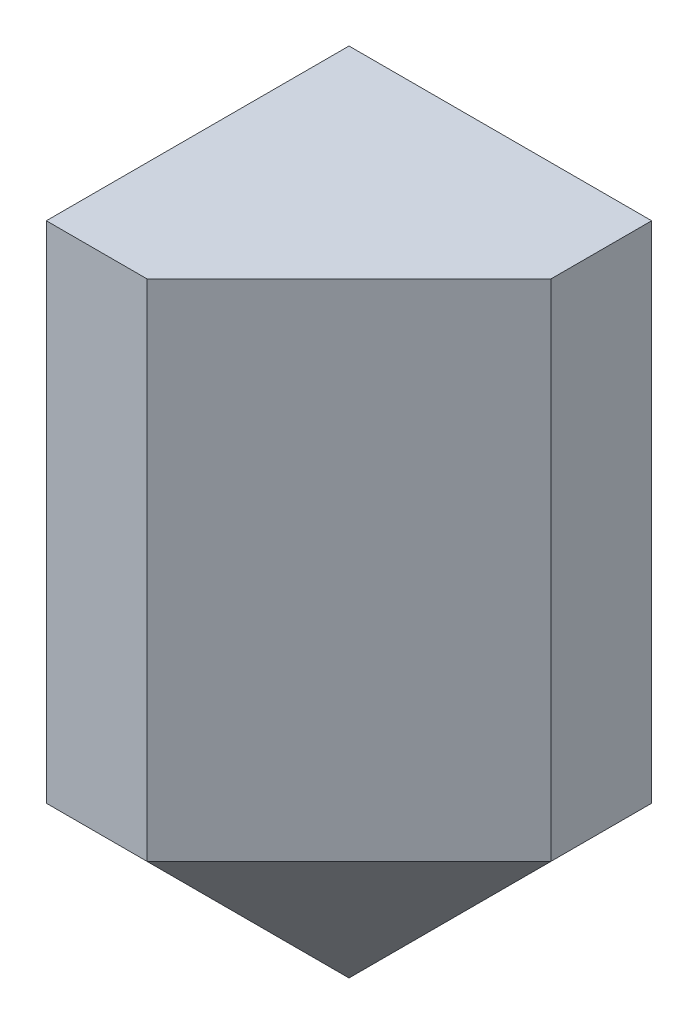
ISO-10303-21;
HEADER;
FILE_DESCRIPTION(('STEP AP214'),'2;1');
FILE_NAME('part.step','',(''),(''),'','','');
FILE_SCHEMA(('AUTOMOTIVE_DESIGN { 1 0 10303 214 1 1 1 1 }'));
ENDSEC;
DATA;
#1=APPLICATION_CONTEXT('core data for automotive mechanical design processes');
#2=APPLICATION_PROTOCOL_DEFINITION('international standard','automotive_design',2000,#1);
#3=PRODUCT_CONTEXT('',#1,'mechanical');
#4=PRODUCT('Part','Part','',(#3));
#5=PRODUCT_RELATED_PRODUCT_CATEGORY('part','',(#4));
#6=PRODUCT_DEFINITION_FORMATION('','',#4);
#7=PRODUCT_DEFINITION_CONTEXT('part definition',#1,'design');
#8=PRODUCT_DEFINITION('design','',#6,#7);
#9=PRODUCT_DEFINITION_SHAPE('','',#8);
#10=(LENGTH_UNIT() NAMED_UNIT(*) SI_UNIT(.MILLI.,.METRE.));
#11=(NAMED_UNIT(*) PLANE_ANGLE_UNIT() SI_UNIT($,.RADIAN.));
#12=(NAMED_UNIT(*) SI_UNIT($,.STERADIAN.) SOLID_ANGLE_UNIT());
#13=UNCERTAINTY_MEASURE_WITH_UNIT(LENGTH_MEASURE(1.E-05),#10,'distance_accuracy_value','');
#14=(GEOMETRIC_REPRESENTATION_CONTEXT(3) GLOBAL_UNCERTAINTY_ASSIGNED_CONTEXT((#13)) GLOBAL_UNIT_ASSIGNED_CONTEXT((#10,
#11,#12)) REPRESENTATION_CONTEXT('',''));
#15=CARTESIAN_POINT('',(0.,0.,0.));
#16=DIRECTION('',(0.,0.,1.));
#17=DIRECTION('',(1.,0.,0.));
#18=AXIS2_PLACEMENT_3D('',#15,#16,#17);
#19=CARTESIAN_POINT('',(0.,0.,30.));
#20=DIRECTION('',(1.,0.,0.));
#21=DIRECTION('',(0.,0.,-1.));
#22=AXIS2_PLACEMENT_3D('',#19,#20,#21);
#23=PLANE('',#22);
#24=CARTESIAN_POINT('',(0.,55.,15.));
#25=DIRECTION('',(-1.,0.,0.));
#26=DIRECTION('',(0.,0.,1.));
#27=AXIS2_PLACEMENT_3D('',#24,#25,#26);
#28=CIRCLE('',#27,7.5);
#29=CARTESIAN_POINT('',(0.,55.,22.5));
#30=VERTEX_POINT('',#29);
#31=EDGE_CURVE('E115',#30,#30,#28,.T.);
#32=ORIENTED_EDGE('',*,*,#31,.F.);
#33=EDGE_LOOP('',(#32));
#34=FACE_BOUND('',#33,.T.);
#35=CARTESIAN_POINT('',(0.,20.,18.));
#36=DIRECTION('',(-1.,0.,0.));
#37=DIRECTION('',(0.,0.,1.));
#38=AXIS2_PLACEMENT_3D('',#35,#36,#37);
#39=CIRCLE('',#38,2.75);
#40=CARTESIAN_POINT('',(0.,20.,20.75));
#41=VERTEX_POINT('',#40);
#42=EDGE_CURVE('E138',#41,#41,#39,.T.);
#43=ORIENTED_EDGE('',*,*,#42,.F.);
#44=EDGE_LOOP('',(#43));
#45=FACE_BOUND('',#44,.T.);
#46=DIRECTION('',(0.,0.,-1.));
#47=VECTOR('',#46,1.);
#48=CARTESIAN_POINT('',(0.,0.,30.));
#49=LINE('',#48,#47);
#50=CARTESIAN_POINT('',(0.,0.,9.99999999999995));
#51=VERTEX_POINT('',#50);
#52=CARTESIAN_POINT('',(0.,0.,0.));
#53=VERTEX_POINT('',#52);
#54=EDGE_CURVE('E163',#51,#53,#49,.T.);
#55=ORIENTED_EDGE('',*,*,#54,.F.);
#56=DIRECTION('',(0.,-0.707106781186546,-0.707106781186549));
#57=VECTOR('',#56,1.);
#58=CARTESIAN_POINT('',(0.,20.,30.));
#59=LINE('',#58,#57);
#60=CARTESIAN_POINT('',(0.,20.,30.));
#61=VERTEX_POINT('',#60);
#62=EDGE_CURVE('E11',#51,#61,#59,.F.);
#63=ORIENTED_EDGE('',*,*,#62,.T.);
#64=DIRECTION('',(0.,-1.,0.));
#65=VECTOR('',#64,1.);
#66=CARTESIAN_POINT('',(0.,0.,30.));
#67=LINE('',#66,#65);
#68=CARTESIAN_POINT('',(0.,70.,30.));
#69=VERTEX_POINT('',#68);
#70=EDGE_CURVE('E160',#69,#61,#67,.T.);
#71=ORIENTED_EDGE('',*,*,#70,.F.);
#72=DIRECTION('',(0.,0.,1.));
#73=VECTOR('',#72,1.);
#74=CARTESIAN_POINT('',(0.,70.,30.));
#75=LINE('',#74,#73);
#76=CARTESIAN_POINT('',(0.,70.,0.));
#77=VERTEX_POINT('',#76);
#78=EDGE_CURVE('E144',#77,#69,#75,.T.);
#79=ORIENTED_EDGE('',*,*,#78,.F.);
#80=DIRECTION('',(0.,-1.,0.));
#81=VECTOR('',#80,1.);
#82=CARTESIAN_POINT('',(0.,0.,0.));
#83=LINE('',#82,#81);
#84=EDGE_CURVE('E165',#77,#53,#83,.T.);
#85=ORIENTED_EDGE('',*,*,#84,.T.);
#86=EDGE_LOOP('',(#55,#63,#71,#79,#85));
#87=FACE_BOUND('',#86,.T.);
#88=ADVANCED_FACE('F39',(#34,#45,#87),#23,.F.);
#89=CARTESIAN_POINT('',(0.,0.,30.));
#90=DIRECTION('',(0.,1.,0.));
#91=DIRECTION('',(0.,0.,1.));
#92=AXIS2_PLACEMENT_3D('',#89,#90,#91);
#93=PLANE('',#92);
#94=DIRECTION('',(1.,0.,0.));
#95=VECTOR('',#94,1.);
#96=CARTESIAN_POINT('',(0.,0.,0.));
#97=LINE('',#96,#95);
#98=CARTESIAN_POINT('',(9.99999999999995,0.,0.));
#99=VERTEX_POINT('',#98);
#100=EDGE_CURVE('E168',#53,#99,#97,.T.);
#101=ORIENTED_EDGE('',*,*,#100,.T.);
#102=DIRECTION('',(0.,0.,1.));
#103=VECTOR('',#102,1.);
#104=CARTESIAN_POINT('',(9.99999999999995,0.,30.));
#105=LINE('',#104,#103);
#106=CARTESIAN_POINT('',(9.99999999999995,0.,9.99999999999995));
#107=VERTEX_POINT('',#106);
#108=EDGE_CURVE('E49',#99,#107,#105,.T.);
#109=ORIENTED_EDGE('',*,*,#108,.T.);
#110=DIRECTION('',(-1.,0.,0.));
#111=VECTOR('',#110,1.);
#112=CARTESIAN_POINT('',(0.,0.,9.99999999999995));
#113=LINE('',#112,#111);
#114=EDGE_CURVE('E60',#107,#51,#113,.T.);
#115=ORIENTED_EDGE('',*,*,#114,.T.);
#116=ORIENTED_EDGE('',*,*,#54,.T.);
#117=EDGE_LOOP('',(#101,#109,#115,#116));
#118=FACE_BOUND('',#117,.T.);
#119=ADVANCED_FACE('F221',(#118),#93,.F.);
#120=CARTESIAN_POINT('',(30.,0.,30.));
#121=DIRECTION('',(-1.,0.,0.));
#122=DIRECTION('',(0.,0.,1.));
#123=AXIS2_PLACEMENT_3D('',#120,#121,#122);
#124=PLANE('',#123);
#125=DIRECTION('',(0.,1.,0.));
#126=VECTOR('',#125,1.);
#127=CARTESIAN_POINT('',(30.,0.,0.));
#128=LINE('',#127,#126);
#129=CARTESIAN_POINT('',(30.,20.,0.));
#130=VERTEX_POINT('',#129);
#131=CARTESIAN_POINT('',(30.,70.,0.));
#132=VERTEX_POINT('',#131);
#133=EDGE_CURVE('E164',#130,#132,#128,.T.);
#134=ORIENTED_EDGE('',*,*,#133,.T.);
#135=DIRECTION('',(0.,0.,-1.));
#136=VECTOR('',#135,1.);
#137=CARTESIAN_POINT('',(30.,70.,0.));
#138=LINE('',#137,#136);
#139=CARTESIAN_POINT('',(30.,70.,9.99999999999992));
#140=VERTEX_POINT('',#139);
#141=EDGE_CURVE('E153',#140,#132,#138,.T.);
#142=ORIENTED_EDGE('',*,*,#141,.F.);
#143=DIRECTION('',(0.,-1.,0.));
#144=VECTOR('',#143,1.);
#145=CARTESIAN_POINT('',(30.,0.,9.99999999999995));
#146=LINE('',#145,#144);
#147=CARTESIAN_POINT('',(30.,20.,9.99999999999995));
#148=VERTEX_POINT('',#147);
#149=EDGE_CURVE('E178',#140,#148,#146,.T.);
#150=ORIENTED_EDGE('',*,*,#149,.T.);
#151=DIRECTION('',(0.,0.,-1.));
#152=VECTOR('',#151,1.);
#153=CARTESIAN_POINT('',(30.,20.,30.));
#154=LINE('',#153,#152);
#155=EDGE_CURVE('E176',#148,#130,#154,.T.);
#156=ORIENTED_EDGE('',*,*,#155,.T.);
#157=EDGE_LOOP('',(#134,#142,#150,#156));
#158=FACE_BOUND('',#157,.T.);
#159=ADVANCED_FACE('F227',(#158),#124,.F.);
#160=CARTESIAN_POINT('',(0.,0.,30.));
#161=DIRECTION('',(0.,0.,-1.));
#162=DIRECTION('',(-1.,0.,0.));
#163=AXIS2_PLACEMENT_3D('',#160,#161,#162);
#164=PLANE('',#163);
#165=DIRECTION('',(1.,0.,0.));
#166=VECTOR('',#165,1.);
#167=CARTESIAN_POINT('',(0.,20.,30.));
#168=LINE('',#167,#166);
#169=CARTESIAN_POINT('',(10.,20.,30.));
#170=VERTEX_POINT('',#169);
#171=EDGE_CURVE('E172',#61,#170,#168,.T.);
#172=ORIENTED_EDGE('',*,*,#171,.T.);
#173=DIRECTION('',(0.,1.,0.));
#174=VECTOR('',#173,1.);
#175=CARTESIAN_POINT('',(10.,0.,30.));
#176=LINE('',#175,#174);
#177=CARTESIAN_POINT('',(9.99999999999999,70.,30.));
#178=VERTEX_POINT('',#177);
#179=EDGE_CURVE('E174',#170,#178,#176,.T.);
#180=ORIENTED_EDGE('',*,*,#179,.T.);
#181=DIRECTION('',(1.,0.,0.));
#182=VECTOR('',#181,1.);
#183=CARTESIAN_POINT('',(9.99999999999999,70.,30.));
#184=LINE('',#183,#182);
#185=EDGE_CURVE('E147',#69,#178,#184,.T.);
#186=ORIENTED_EDGE('',*,*,#185,.F.);
#187=ORIENTED_EDGE('',*,*,#70,.T.);
#188=EDGE_LOOP('',(#172,#180,#186,#187));
#189=FACE_BOUND('',#188,.T.);
#190=ADVANCED_FACE('F201',(#189),#164,.F.);
#191=CARTESIAN_POINT('',(0.,0.,0.));
#192=DIRECTION('',(0.,0.,-1.));
#193=DIRECTION('',(-1.,0.,0.));
#194=AXIS2_PLACEMENT_3D('',#191,#192,#193);
#195=PLANE('',#194);
#196=CARTESIAN_POINT('',(14.,48.,0.));
#197=DIRECTION('',(0.,0.,-1.));
#198=DIRECTION('',(-1.,0.,0.));
#199=AXIS2_PLACEMENT_3D('',#196,#197,#198);
#200=CIRCLE('',#199,2.74999999999999);
#201=CARTESIAN_POINT('',(11.25,48.,0.));
#202=VERTEX_POINT('',#201);
#203=EDGE_CURVE('E125',#202,#202,#200,.T.);
#204=ORIENTED_EDGE('',*,*,#203,.F.);
#205=EDGE_LOOP('',(#204));
#206=FACE_BOUND('',#205,.T.);
#207=CARTESIAN_POINT('',(18.,20.,0.));
#208=DIRECTION('',(0.,0.,-1.));
#209=DIRECTION('',(-1.,0.,0.));
#210=AXIS2_PLACEMENT_3D('',#207,#208,#209);
#211=CIRCLE('',#210,2.74999999999999);
#212=CARTESIAN_POINT('',(15.25,20.,0.));
#213=VERTEX_POINT('',#212);
#214=EDGE_CURVE('E132',#213,#213,#211,.T.);
#215=ORIENTED_EDGE('',*,*,#214,.F.);
#216=EDGE_LOOP('',(#215));
#217=FACE_BOUND('',#216,.T.);
#218=ORIENTED_EDGE('',*,*,#133,.F.);
#219=DIRECTION('',(0.707106781186549,0.707106781186546,0.));
#220=VECTOR('',#219,1.);
#221=CARTESIAN_POINT('',(4.99999999999996,-4.99999999999997,0.));
#222=LINE('',#221,#220);
#223=EDGE_CURVE('E180',#130,#99,#222,.F.);
#224=ORIENTED_EDGE('',*,*,#223,.T.);
#225=ORIENTED_EDGE('',*,*,#100,.F.);
#226=ORIENTED_EDGE('',*,*,#84,.F.);
#227=DIRECTION('',(-1.,0.,0.));
#228=VECTOR('',#227,1.);
#229=CARTESIAN_POINT('',(0.,70.,0.));
#230=LINE('',#229,#228);
#231=EDGE_CURVE('E156',#132,#77,#230,.T.);
#232=ORIENTED_EDGE('',*,*,#231,.F.);
#233=EDGE_LOOP('',(#218,#224,#225,#226,#232));
#234=FACE_BOUND('',#233,.T.);
#235=ADVANCED_FACE('F218',(#206,#217,#234),#195,.T.);
#236=CARTESIAN_POINT('',(30.,20.,30.));
#237=DIRECTION('',(-0.707106781186546,0.707106781186549,0.));
#238=DIRECTION('',(0.,0.,-1.));
#239=AXIS2_PLACEMENT_3D('',#236,#237,#238);
#240=PLANE('',#239);
#241=ORIENTED_EDGE('',*,*,#223,.F.);
#242=ORIENTED_EDGE('',*,*,#155,.F.);
#243=DIRECTION('',(-0.707106781186549,-0.707106781186546,0.));
#244=VECTOR('',#243,1.);
#245=CARTESIAN_POINT('',(30.,20.,9.99999999999995));
#246=LINE('',#245,#244);
#247=EDGE_CURVE('E44',#107,#148,#246,.F.);
#248=ORIENTED_EDGE('',*,*,#247,.F.);
#249=ORIENTED_EDGE('',*,*,#108,.F.);
#250=EDGE_LOOP('',(#241,#242,#248,#249));
#251=FACE_BOUND('',#250,.T.);
#252=ADVANCED_FACE('F42',(#251),#240,.F.);
#253=CARTESIAN_POINT('',(0.,20.,30.));
#254=DIRECTION('',(0.,0.707106781186549,-0.707106781186546));
#255=DIRECTION('',(1.,0.,0.));
#256=AXIS2_PLACEMENT_3D('',#253,#254,#255);
#257=PLANE('',#256);
#258=ORIENTED_EDGE('',*,*,#62,.F.);
#259=ORIENTED_EDGE('',*,*,#114,.F.);
#260=DIRECTION('',(0.,0.707106781186546,0.707106781186549));
#261=VECTOR('',#260,1.);
#262=CARTESIAN_POINT('',(9.99999999999998,10.,20.));
#263=LINE('',#262,#261);
#264=EDGE_CURVE('E185',#170,#107,#263,.F.);
#265=ORIENTED_EDGE('',*,*,#264,.F.);
#266=ORIENTED_EDGE('',*,*,#171,.F.);
#267=EDGE_LOOP('',(#258,#259,#265,#266));
#268=FACE_BOUND('',#267,.T.);
#269=ADVANCED_FACE('F211',(#268),#257,.F.);
#270=CARTESIAN_POINT('',(30.,20.,9.99999999999995));
#271=DIRECTION('',(0.577350269189626,-0.577350269189628,0.577350269189624));
#272=DIRECTION('',(0.707106781186549,0.707106781186546,0.));
#273=AXIS2_PLACEMENT_3D('',#270,#271,#272);
#274=PLANE('',#273);
#275=ORIENTED_EDGE('',*,*,#264,.T.);
#276=ORIENTED_EDGE('',*,*,#247,.T.);
#277=DIRECTION('',(0.707106781186546,0.,-0.707106781186549));
#278=VECTOR('',#277,1.);
#279=CARTESIAN_POINT('',(30.,20.,9.99999999999995));
#280=LINE('',#279,#278);
#281=EDGE_CURVE('E159',#170,#148,#280,.T.);
#282=ORIENTED_EDGE('',*,*,#281,.F.);
#283=EDGE_LOOP('',(#275,#276,#282));
#284=FACE_BOUND('',#283,.T.);
#285=ADVANCED_FACE('F192',(#284),#274,.T.);
#286=CARTESIAN_POINT('',(10.,0.,30.));
#287=DIRECTION('',(-0.707106781186549,0.,-0.707106781186546));
#288=DIRECTION('',(0.,1.,0.));
#289=AXIS2_PLACEMENT_3D('',#286,#287,#288);
#290=PLANE('',#289);
#291=ORIENTED_EDGE('',*,*,#281,.T.);
#292=ORIENTED_EDGE('',*,*,#149,.F.);
#293=DIRECTION('',(0.707106781186546,0.,-0.707106781186549));
#294=VECTOR('',#293,1.);
#295=CARTESIAN_POINT('',(30.,70.,9.99999999999992));
#296=LINE('',#295,#294);
#297=EDGE_CURVE('E150',#178,#140,#296,.T.);
#298=ORIENTED_EDGE('',*,*,#297,.F.);
#299=ORIENTED_EDGE('',*,*,#179,.F.);
#300=EDGE_LOOP('',(#291,#292,#298,#299));
#301=FACE_BOUND('',#300,.T.);
#302=ADVANCED_FACE('F197',(#301),#290,.F.);
#303=CARTESIAN_POINT('',(0.,70.,0.));
#304=DIRECTION('',(0.,-1.,0.));
#305=DIRECTION('',(0.,0.,-1.));
#306=AXIS2_PLACEMENT_3D('',#303,#304,#305);
#307=PLANE('',#306);
#308=ORIENTED_EDGE('',*,*,#78,.T.);
#309=ORIENTED_EDGE('',*,*,#185,.T.);
#310=ORIENTED_EDGE('',*,*,#297,.T.);
#311=ORIENTED_EDGE('',*,*,#141,.T.);
#312=ORIENTED_EDGE('',*,*,#231,.T.);
#313=EDGE_LOOP('',(#308,#309,#310,#311,#312));
#314=FACE_BOUND('',#313,.T.);
#315=ADVANCED_FACE('F204',(#314),#307,.F.);
#316=CARTESIAN_POINT('',(13.,20.,18.));
#317=DIRECTION('',(-1.,0.,0.));
#318=DIRECTION('',(0.,0.,1.));
#319=AXIS2_PLACEMENT_3D('',#316,#317,#318);
#320=CONICAL_SURFACE('',#319,2.75,1.02974425867665);
#321=CARTESIAN_POINT('',(14.6523667023258,20.,18.));
#322=VERTEX_POINT('',#321);
#323=VERTEX_LOOP('',#322);
#324=FACE_BOUND('',#323,.T.);
#325=CARTESIAN_POINT('',(13.,20.,18.));
#326=DIRECTION('',(-1.,0.,0.));
#327=DIRECTION('',(0.,0.,1.));
#328=AXIS2_PLACEMENT_3D('',#325,#326,#327);
#329=CIRCLE('',#328,2.75);
#330=CARTESIAN_POINT('',(13.,20.,20.75));
#331=VERTEX_POINT('',#330);
#332=EDGE_CURVE('E141',#331,#331,#329,.T.);
#333=ORIENTED_EDGE('',*,*,#332,.T.);
#334=EDGE_LOOP('',(#333));
#335=FACE_BOUND('',#334,.T.);
#336=ADVANCED_FACE('F247',(#324,#335),#320,.F.);
#337=CARTESIAN_POINT('',(0.,20.,18.));
#338=DIRECTION('',(-1.,0.,0.));
#339=DIRECTION('',(0.,0.,1.));
#340=AXIS2_PLACEMENT_3D('',#337,#338,#339);
#341=CYLINDRICAL_SURFACE('',#340,2.75);
#342=ORIENTED_EDGE('',*,*,#332,.F.);
#343=EDGE_LOOP('',(#342));
#344=FACE_BOUND('',#343,.T.);
#345=ORIENTED_EDGE('',*,*,#42,.T.);
#346=EDGE_LOOP('',(#345));
#347=FACE_BOUND('',#346,.T.);
#348=ADVANCED_FACE('F252',(#344,#347),#341,.F.);
#349=CARTESIAN_POINT('',(18.,20.,13.));
#350=DIRECTION('',(0.,0.,-1.));
#351=DIRECTION('',(-1.,0.,0.));
#352=AXIS2_PLACEMENT_3D('',#349,#350,#351);
#353=CONICAL_SURFACE('',#352,2.75,1.02974425867665);
#354=CARTESIAN_POINT('',(18.,20.,14.6523667023258));
#355=VERTEX_POINT('',#354);
#356=VERTEX_LOOP('',#355);
#357=FACE_BOUND('',#356,.T.);
#358=CARTESIAN_POINT('',(18.,20.,13.));
#359=DIRECTION('',(0.,0.,-1.));
#360=DIRECTION('',(-1.,0.,0.));
#361=AXIS2_PLACEMENT_3D('',#358,#359,#360);
#362=CIRCLE('',#361,2.75);
#363=CARTESIAN_POINT('',(15.25,20.,13.));
#364=VERTEX_POINT('',#363);
#365=EDGE_CURVE('E135',#364,#364,#362,.T.);
#366=ORIENTED_EDGE('',*,*,#365,.T.);
#367=EDGE_LOOP('',(#366));
#368=FACE_BOUND('',#367,.T.);
#369=ADVANCED_FACE('F419',(#357,#368),#353,.F.);
#370=CARTESIAN_POINT('',(18.,20.,0.));
#371=DIRECTION('',(0.,0.,-1.));
#372=DIRECTION('',(-1.,0.,0.));
#373=AXIS2_PLACEMENT_3D('',#370,#371,#372);
#374=CYLINDRICAL_SURFACE('',#373,2.74999999999999);
#375=ORIENTED_EDGE('',*,*,#365,.F.);
#376=EDGE_LOOP('',(#375));
#377=FACE_BOUND('',#376,.T.);
#378=ORIENTED_EDGE('',*,*,#214,.T.);
#379=EDGE_LOOP('',(#378));
#380=FACE_BOUND('',#379,.T.);
#381=ADVANCED_FACE('F410',(#377,#380),#374,.F.);
#382=CARTESIAN_POINT('',(14.,48.,13.));
#383=DIRECTION('',(0.,0.,-1.));
#384=DIRECTION('',(-1.,0.,0.));
#385=AXIS2_PLACEMENT_3D('',#382,#383,#384);
#386=CONICAL_SURFACE('',#385,2.75,1.02974425867665);
#387=CARTESIAN_POINT('',(14.,48.,14.6523667023258));
#388=VERTEX_POINT('',#387);
#389=VERTEX_LOOP('',#388);
#390=FACE_BOUND('',#389,.T.);
#391=CARTESIAN_POINT('',(14.,48.,13.));
#392=DIRECTION('',(0.,0.,-1.));
#393=DIRECTION('',(-1.,0.,0.));
#394=AXIS2_PLACEMENT_3D('',#391,#392,#393);
#395=CIRCLE('',#394,2.75);
#396=CARTESIAN_POINT('',(11.25,48.,13.));
#397=VERTEX_POINT('',#396);
#398=EDGE_CURVE('E129',#397,#397,#395,.T.);
#399=ORIENTED_EDGE('',*,*,#398,.T.);
#400=EDGE_LOOP('',(#399));
#401=FACE_BOUND('',#400,.T.);
#402=ADVANCED_FACE('F401',(#390,#401),#386,.F.);
#403=CARTESIAN_POINT('',(14.,48.,0.));
#404=DIRECTION('',(0.,0.,-1.));
#405=DIRECTION('',(-1.,0.,0.));
#406=AXIS2_PLACEMENT_3D('',#403,#404,#405);
#407=CYLINDRICAL_SURFACE('',#406,2.74999999999999);
#408=ORIENTED_EDGE('',*,*,#398,.F.);
#409=EDGE_LOOP('',(#408));
#410=FACE_BOUND('',#409,.T.);
#411=ORIENTED_EDGE('',*,*,#203,.T.);
#412=EDGE_LOOP('',(#411));
#413=FACE_BOUND('',#412,.T.);
#414=ADVANCED_FACE('F353',(#410,#413),#407,.F.);
#415=CARTESIAN_POINT('',(3.,55.,15.));
#416=DIRECTION('',(-1.,0.,0.));
#417=DIRECTION('',(0.,0.,1.));
#418=AXIS2_PLACEMENT_3D('',#415,#416,#417);
#419=CYLINDRICAL_SURFACE('',#418,7.5);
#420=CARTESIAN_POINT('',(3.,55.,15.));
#421=DIRECTION('',(-1.,0.,0.));
#422=DIRECTION('',(0.,0.,1.));
#423=AXIS2_PLACEMENT_3D('',#420,#421,#422);
#424=CIRCLE('',#423,7.5);
#425=CARTESIAN_POINT('',(3.,55.,22.5));
#426=VERTEX_POINT('',#425);
#427=EDGE_CURVE('E119',#426,#426,#424,.T.);
#428=ORIENTED_EDGE('',*,*,#427,.F.);
#429=EDGE_LOOP('',(#428));
#430=FACE_BOUND('',#429,.T.);
#431=ORIENTED_EDGE('',*,*,#31,.T.);
#432=EDGE_LOOP('',(#431));
#433=FACE_BOUND('',#432,.T.);
#434=ADVANCED_FACE('F358',(#430,#433),#419,.F.);
#435=CARTESIAN_POINT('',(3.,55.,15.));
#436=DIRECTION('',(-1.,0.,0.));
#437=DIRECTION('',(0.,0.,1.));
#438=AXIS2_PLACEMENT_3D('',#435,#436,#437);
#439=PLANE('',#438);
#440=CARTESIAN_POINT('',(3.,55.,15.));
#441=DIRECTION('',(-1.,0.,0.));
#442=DIRECTION('',(0.,0.,1.));
#443=AXIS2_PLACEMENT_3D('',#440,#441,#442);
#444=CIRCLE('',#443,2.19999999999999);
#445=CARTESIAN_POINT('',(3.,55.,17.2));
#446=VERTEX_POINT('',#445);
#447=EDGE_CURVE('E116',#446,#446,#444,.T.);
#448=ORIENTED_EDGE('',*,*,#447,.F.);
#449=EDGE_LOOP('',(#448));
#450=FACE_BOUND('',#449,.T.);
#451=ORIENTED_EDGE('',*,*,#427,.T.);
#452=EDGE_LOOP('',(#451));
#453=FACE_BOUND('',#452,.T.);
#454=ADVANCED_FACE('F109',(#450,#453),#439,.T.);
#455=CARTESIAN_POINT('',(13.,55.,15.));
#456=DIRECTION('',(-1.,0.,0.));
#457=DIRECTION('',(0.,0.,1.));
#458=AXIS2_PLACEMENT_3D('',#455,#456,#457);
#459=CONICAL_SURFACE('',#458,2.19999999999999,1.02974425867665);
#460=CARTESIAN_POINT('',(14.3218933618606,55.,15.));
#461=VERTEX_POINT('',#460);
#462=VERTEX_LOOP('',#461);
#463=FACE_BOUND('',#462,.T.);
#464=CARTESIAN_POINT('',(13.,55.,15.));
#465=DIRECTION('',(-1.,0.,0.));
#466=DIRECTION('',(0.,0.,1.));
#467=AXIS2_PLACEMENT_3D('',#464,#465,#466);
#468=CIRCLE('',#467,2.19999999999999);
#469=CARTESIAN_POINT('',(13.,55.,17.2));
#470=VERTEX_POINT('',#469);
#471=EDGE_CURVE('E113',#470,#470,#468,.T.);
#472=ORIENTED_EDGE('',*,*,#471,.T.);
#473=EDGE_LOOP('',(#472));
#474=FACE_BOUND('',#473,.T.);
#475=ADVANCED_FACE('F105',(#463,#474),#459,.F.);
#476=CARTESIAN_POINT('',(3.,55.,15.));
#477=DIRECTION('',(-1.,0.,0.));
#478=DIRECTION('',(0.,0.,1.));
#479=AXIS2_PLACEMENT_3D('',#476,#477,#478);
#480=CYLINDRICAL_SURFACE('',#479,2.19999999999999);
#481=ORIENTED_EDGE('',*,*,#471,.F.);
#482=EDGE_LOOP('',(#481));
#483=FACE_BOUND('',#482,.T.);
#484=ORIENTED_EDGE('',*,*,#447,.T.);
#485=EDGE_LOOP('',(#484));
#486=FACE_BOUND('',#485,.T.);
#487=ADVANCED_FACE('F108',(#483,#486),#480,.F.);
#488=CLOSED_SHELL('',(#88,#119,#159,#190,#235,#252,#269,#285,#302,#315,#336,#348,#369,#381,#402,
#414,#434,#454,#475,#487));
#489=MANIFOLD_SOLID_BREP('B2',#488);
#490=ADVANCED_BREP_SHAPE_REPRESENTATION('',(#18,#489),#14);
#491=SHAPE_DEFINITION_REPRESENTATION(#9,#490);
ENDSEC;
END-ISO-10303-21;
